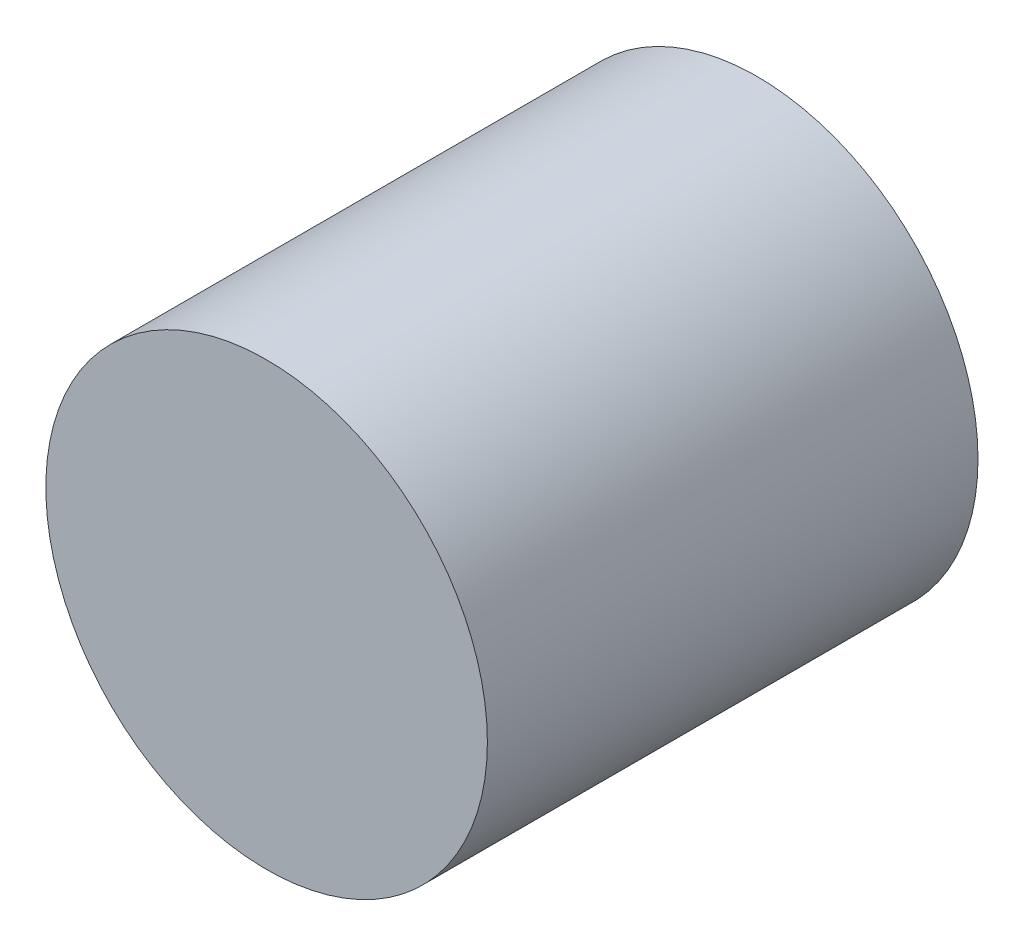
ISO-10303-21;
HEADER;
FILE_DESCRIPTION(('STEP AP214'),'2;1');
FILE_NAME('part.step','',(''),(''),'','','');
FILE_SCHEMA(('AUTOMOTIVE_DESIGN { 1 0 10303 214 1 1 1 1 }'));
ENDSEC;
DATA;
#1=APPLICATION_CONTEXT('core data for automotive mechanical design processes');
#2=APPLICATION_PROTOCOL_DEFINITION('international standard','automotive_design',2000,#1);
#3=PRODUCT_CONTEXT('',#1,'mechanical');
#4=PRODUCT('Part','Part','',(#3));
#5=PRODUCT_RELATED_PRODUCT_CATEGORY('part','',(#4));
#6=PRODUCT_DEFINITION_FORMATION('','',#4);
#7=PRODUCT_DEFINITION_CONTEXT('part definition',#1,'design');
#8=PRODUCT_DEFINITION('design','',#6,#7);
#9=PRODUCT_DEFINITION_SHAPE('','',#8);
#10=(LENGTH_UNIT() NAMED_UNIT(*) SI_UNIT(.MILLI.,.METRE.));
#11=(NAMED_UNIT(*) PLANE_ANGLE_UNIT() SI_UNIT($,.RADIAN.));
#12=(NAMED_UNIT(*) SI_UNIT($,.STERADIAN.) SOLID_ANGLE_UNIT());
#13=UNCERTAINTY_MEASURE_WITH_UNIT(LENGTH_MEASURE(1.E-05),#10,'distance_accuracy_value','');
#14=(GEOMETRIC_REPRESENTATION_CONTEXT(3) GLOBAL_UNCERTAINTY_ASSIGNED_CONTEXT((#13)) GLOBAL_UNIT_ASSIGNED_CONTEXT((#10,
#11,#12)) REPRESENTATION_CONTEXT('',''));
#15=CARTESIAN_POINT('',(0.,0.,0.));
#16=DIRECTION('',(0.,0.,1.));
#17=DIRECTION('',(1.,0.,0.));
#18=AXIS2_PLACEMENT_3D('',#15,#16,#17);
#19=CARTESIAN_POINT('',(0.,0.,120.));
#20=DIRECTION('',(0.,0.,-1.));
#21=DIRECTION('',(-1.,0.,0.));
#22=AXIS2_PLACEMENT_3D('',#19,#20,#21);
#23=CYLINDRICAL_SURFACE('',#22,54.);
#24=CARTESIAN_POINT('',(0.,0.,120.));
#25=DIRECTION('',(0.,0.,1.));
#26=DIRECTION('',(1.,0.,0.));
#27=AXIS2_PLACEMENT_3D('',#24,#25,#26);
#28=CIRCLE('',#27,54.);
#29=CARTESIAN_POINT('',(54.,0.,120.));
#30=VERTEX_POINT('',#29);
#31=EDGE_CURVE('E10',#30,#30,#28,.T.);
#32=ORIENTED_EDGE('',*,*,#31,.F.);
#33=EDGE_LOOP('',(#32));
#34=FACE_BOUND('',#33,.T.);
#35=CARTESIAN_POINT('',(0.,0.,0.));
#36=DIRECTION('',(0.,0.,1.));
#37=DIRECTION('',(1.,0.,0.));
#38=AXIS2_PLACEMENT_3D('',#35,#36,#37);
#39=CIRCLE('',#38,54.);
#40=CARTESIAN_POINT('',(54.,0.,0.));
#41=VERTEX_POINT('',#40);
#42=EDGE_CURVE('E34',#41,#41,#39,.T.);
#43=ORIENTED_EDGE('',*,*,#42,.T.);
#44=EDGE_LOOP('',(#43));
#45=FACE_BOUND('',#44,.T.);
#46=ADVANCED_FACE('F31',(#34,#45),#23,.T.);
#47=CARTESIAN_POINT('',(0.,0.,120.));
#48=DIRECTION('',(0.,0.,1.));
#49=DIRECTION('',(1.,0.,0.));
#50=AXIS2_PLACEMENT_3D('',#47,#48,#49);
#51=PLANE('',#50);
#52=ORIENTED_EDGE('',*,*,#31,.T.);
#53=EDGE_LOOP('',(#52));
#54=FACE_BOUND('',#53,.T.);
#55=ADVANCED_FACE('F46',(#54),#51,.T.);
#56=CARTESIAN_POINT('',(0.,0.,0.));
#57=DIRECTION('',(0.,0.,1.));
#58=DIRECTION('',(1.,0.,0.));
#59=AXIS2_PLACEMENT_3D('',#56,#57,#58);
#60=PLANE('',#59);
#61=ORIENTED_EDGE('',*,*,#42,.F.);
#62=EDGE_LOOP('',(#61));
#63=FACE_BOUND('',#62,.T.);
#64=ADVANCED_FACE('F44',(#63),#60,.F.);
#65=CLOSED_SHELL('',(#46,#55,#64));
#66=MANIFOLD_SOLID_BREP('B2',#65);
#67=ADVANCED_BREP_SHAPE_REPRESENTATION('',(#18,#66),#14);
#68=SHAPE_DEFINITION_REPRESENTATION(#9,#67);
ENDSEC;
END-ISO-10303-21;
